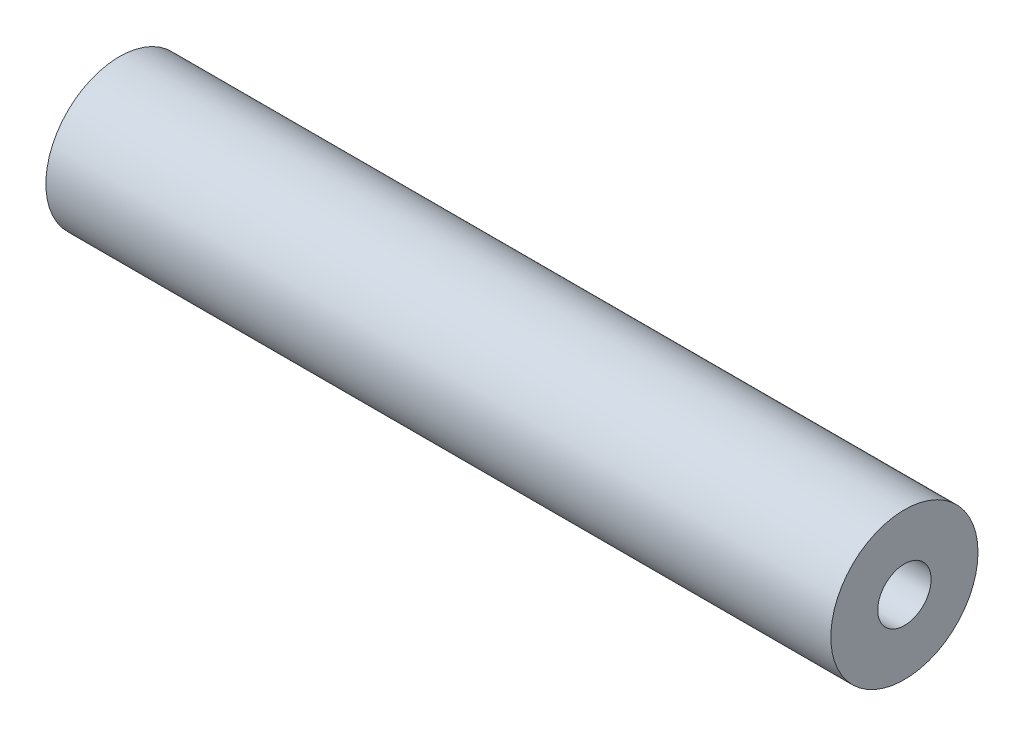
ISO-10303-21;
HEADER;
FILE_DESCRIPTION(('STEP AP214'),'2;1');
FILE_NAME('part.step','',(''),(''),'','','');
FILE_SCHEMA(('AUTOMOTIVE_DESIGN { 1 0 10303 214 1 1 1 1 }'));
ENDSEC;
DATA;
#1=APPLICATION_CONTEXT('core data for automotive mechanical design processes');
#2=APPLICATION_PROTOCOL_DEFINITION('international standard','automotive_design',2000,#1);
#3=PRODUCT_CONTEXT('',#1,'mechanical');
#4=PRODUCT('Part','Part','',(#3));
#5=PRODUCT_RELATED_PRODUCT_CATEGORY('part','',(#4));
#6=PRODUCT_DEFINITION_FORMATION('','',#4);
#7=PRODUCT_DEFINITION_CONTEXT('part definition',#1,'design');
#8=PRODUCT_DEFINITION('design','',#6,#7);
#9=PRODUCT_DEFINITION_SHAPE('','',#8);
#10=(LENGTH_UNIT() NAMED_UNIT(*) SI_UNIT(.MILLI.,.METRE.));
#11=(NAMED_UNIT(*) PLANE_ANGLE_UNIT() SI_UNIT($,.RADIAN.));
#12=(NAMED_UNIT(*) SI_UNIT($,.STERADIAN.) SOLID_ANGLE_UNIT());
#13=UNCERTAINTY_MEASURE_WITH_UNIT(LENGTH_MEASURE(1.E-05),#10,'distance_accuracy_value','');
#14=(GEOMETRIC_REPRESENTATION_CONTEXT(3) GLOBAL_UNCERTAINTY_ASSIGNED_CONTEXT((#13)) GLOBAL_UNIT_ASSIGNED_CONTEXT((#10,
#11,#12)) REPRESENTATION_CONTEXT('',''));
#15=CARTESIAN_POINT('',(0.,0.,0.));
#16=DIRECTION('',(0.,0.,1.));
#17=DIRECTION('',(1.,0.,0.));
#18=AXIS2_PLACEMENT_3D('',#15,#16,#17);
#19=CARTESIAN_POINT('',(19.557999999904,0.,0.));
#20=DIRECTION('',(1.,0.,0.));
#21=DIRECTION('',(0.,0.,-1.));
#22=AXIS2_PLACEMENT_3D('',#19,#20,#21);
#23=CONICAL_SURFACE('',#22,1.7271999997206,1.02974425844676);
#24=CARTESIAN_POINT('',(19.558,0.,0.));
#25=DIRECTION('',(1.,0.,0.));
#26=DIRECTION('',(0.,0.,-1.));
#27=AXIS2_PLACEMENT_3D('',#24,#25,#26);
#28=CIRCLE('',#27,1.7272);
#29=CARTESIAN_POINT('',(19.558,0.,-1.7272));
#30=VERTEX_POINT('',#29);
#31=EDGE_CURVE('P0_E69',#30,#30,#28,.T.);
#32=ORIENTED_EDGE('',*,*,#31,.T.);
#33=EDGE_LOOP('',(#32));
#34=FACE_BOUND('',#33,.T.);
#35=CARTESIAN_POINT('',(18.5201935387909,-1.98951966012828E-10,0.));
#36=VERTEX_POINT('',#35);
#37=VERTEX_LOOP('',#36);
#38=FACE_BOUND('',#37,.T.);
#39=ADVANCED_FACE('P0_F17',(#34,#38),#23,.F.);
#40=CARTESIAN_POINT('',(-10.413999999912,0.,0.));
#41=DIRECTION('',(-1.,0.,0.));
#42=DIRECTION('',(0.,0.,1.));
#43=AXIS2_PLACEMENT_3D('',#40,#41,#42);
#44=CONICAL_SURFACE('',#43,1.72719999977744,1.02974425845164);
#45=CARTESIAN_POINT('',(-10.414,0.,0.));
#46=DIRECTION('',(-1.,0.,0.));
#47=DIRECTION('',(0.,0.,1.));
#48=AXIS2_PLACEMENT_3D('',#45,#46,#47);
#49=CIRCLE('',#48,1.7272);
#50=CARTESIAN_POINT('',(-10.414,0.,1.7272));
#51=VERTEX_POINT('',#50);
#52=EDGE_CURVE('P0_E73',#51,#51,#49,.T.);
#53=ORIENTED_EDGE('',*,*,#52,.T.);
#54=EDGE_LOOP('',(#53));
#55=FACE_BOUND('',#54,.T.);
#56=CARTESIAN_POINT('',(-9.37619353868513,1.98951966012828E-10,0.));
#57=VERTEX_POINT('',#56);
#58=VERTEX_LOOP('',#57);
#59=FACE_BOUND('',#58,.T.);
#60=ADVANCED_FACE('P0_F33',(#55,#59),#44,.F.);
#61=CARTESIAN_POINT('',(17.9476032157556,0.,0.));
#62=DIRECTION('',(1.,0.,0.));
#63=DIRECTION('',(0.,0.,-1.));
#64=AXIS2_PLACEMENT_3D('',#61,#62,#63);
#65=CYLINDRICAL_SURFACE('',#64,1.7272);
#66=ORIENTED_EDGE('',*,*,#31,.F.);
#67=EDGE_LOOP('',(#66));
#68=FACE_BOUND('',#67,.T.);
#69=CARTESIAN_POINT('',(29.972,0.,0.));
#70=DIRECTION('',(1.,0.,0.));
#71=DIRECTION('',(0.,0.,-1.));
#72=AXIS2_PLACEMENT_3D('',#69,#70,#71);
#73=CIRCLE('',#72,1.7272);
#74=CARTESIAN_POINT('',(29.972,0.,-1.7272));
#75=VERTEX_POINT('',#74);
#76=EDGE_CURVE('P0_E20',#75,#75,#73,.T.);
#77=ORIENTED_EDGE('',*,*,#76,.T.);
#78=EDGE_LOOP('',(#77));
#79=FACE_BOUND('',#78,.T.);
#80=ADVANCED_FACE('P0_F39',(#68,#79),#65,.F.);
#81=CARTESIAN_POINT('',(-8.80360321575556,0.,0.));
#82=DIRECTION('',(-1.,0.,0.));
#83=DIRECTION('',(0.,0.,1.));
#84=AXIS2_PLACEMENT_3D('',#81,#82,#83);
#85=CYLINDRICAL_SURFACE('',#84,1.7272);
#86=ORIENTED_EDGE('',*,*,#52,.F.);
#87=EDGE_LOOP('',(#86));
#88=FACE_BOUND('',#87,.T.);
#89=CARTESIAN_POINT('',(-20.828,0.,0.));
#90=DIRECTION('',(-1.,0.,0.));
#91=DIRECTION('',(0.,0.,1.));
#92=AXIS2_PLACEMENT_3D('',#89,#90,#91);
#93=CIRCLE('',#92,1.7272);
#94=CARTESIAN_POINT('',(-20.828,0.,1.7272));
#95=VERTEX_POINT('',#94);
#96=EDGE_CURVE('P0_E72',#95,#95,#93,.T.);
#97=ORIENTED_EDGE('',*,*,#96,.T.);
#98=EDGE_LOOP('',(#97));
#99=FACE_BOUND('',#98,.T.);
#100=ADVANCED_FACE('P0_F58',(#88,#99),#85,.F.);
#101=CARTESIAN_POINT('',(29.972,36.83,57.15));
#102=DIRECTION('',(-1.,0.,0.));
#103=DIRECTION('',(0.,0.,1.));
#104=AXIS2_PLACEMENT_3D('',#101,#102,#103);
#105=PLANE('',#104);
#106=ORIENTED_EDGE('',*,*,#76,.F.);
#107=EDGE_LOOP('',(#106));
#108=FACE_BOUND('',#107,.T.);
#109=CARTESIAN_POINT('',(29.972,0.,0.));
#110=DIRECTION('',(1.,0.,0.));
#111=DIRECTION('',(0.,0.,-1.));
#112=AXIS2_PLACEMENT_3D('',#109,#110,#111);
#113=CIRCLE('',#112,4.7625);
#114=CARTESIAN_POINT('',(29.972,0.,-4.7625));
#115=VERTEX_POINT('',#114);
#116=EDGE_CURVE('P0_E26',#115,#115,#113,.F.);
#117=ORIENTED_EDGE('',*,*,#116,.F.);
#118=EDGE_LOOP('',(#117));
#119=FACE_BOUND('',#118,.T.);
#120=ADVANCED_FACE('P0_F50',(#108,#119),#105,.F.);
#121=CARTESIAN_POINT('',(-20.828,49.53,57.15));
#122=DIRECTION('',(1.,0.,0.));
#123=DIRECTION('',(0.,0.,-1.));
#124=AXIS2_PLACEMENT_3D('',#121,#122,#123);
#125=PLANE('',#124);
#126=ORIENTED_EDGE('',*,*,#96,.F.);
#127=EDGE_LOOP('',(#126));
#128=FACE_BOUND('',#127,.T.);
#129=CARTESIAN_POINT('',(-20.828,0.,0.));
#130=DIRECTION('',(1.,0.,0.));
#131=DIRECTION('',(0.,0.,-1.));
#132=AXIS2_PLACEMENT_3D('',#129,#130,#131);
#133=CIRCLE('',#132,4.7625);
#134=CARTESIAN_POINT('',(-20.828,0.,-4.7625));
#135=VERTEX_POINT('',#134);
#136=EDGE_CURVE('P0_E11',#135,#135,#133,.T.);
#137=ORIENTED_EDGE('',*,*,#136,.F.);
#138=EDGE_LOOP('',(#137));
#139=FACE_BOUND('',#138,.T.);
#140=ADVANCED_FACE('P0_F44',(#128,#139),#125,.F.);
#141=CARTESIAN_POINT('',(-20.828,0.,0.));
#142=DIRECTION('',(1.,0.,0.));
#143=DIRECTION('',(0.,0.,-1.));
#144=AXIS2_PLACEMENT_3D('',#141,#142,#143);
#145=CYLINDRICAL_SURFACE('',#144,4.7625);
#146=ORIENTED_EDGE('',*,*,#116,.T.);
#147=EDGE_LOOP('',(#146));
#148=FACE_BOUND('',#147,.T.);
#149=ORIENTED_EDGE('',*,*,#136,.T.);
#150=EDGE_LOOP('',(#149));
#151=FACE_BOUND('',#150,.T.);
#152=ADVANCED_FACE('P0_F42',(#148,#151),#145,.T.);
#153=CLOSED_SHELL('',(#39,#60,#80,#100,#120,#140,#152));
#154=MANIFOLD_SOLID_BREP('P0_B1',#153);
#155=CARTESIAN_POINT('',(-8.80360321575556,0.,0.));
#156=DIRECTION('',(-1.,0.,0.));
#157=DIRECTION('',(0.,0.,1.));
#158=AXIS2_PLACEMENT_3D('',#155,#156,#157);
#159=CYLINDRICAL_SURFACE('',#158,2.0828);
#160=CARTESIAN_POINT('',(-12.446,0.,0.));
#161=DIRECTION('',(-1.,0.,0.));
#162=DIRECTION('',(0.,0.,1.));
#163=AXIS2_PLACEMENT_3D('',#160,#161,#162);
#164=CIRCLE('',#163,2.0828);
#165=CARTESIAN_POINT('',(-12.446,0.,2.0828));
#166=VERTEX_POINT('',#165);
#167=EDGE_CURVE('P1_E11',#166,#166,#164,.T.);
#168=ORIENTED_EDGE('',*,*,#167,.T.);
#169=EDGE_LOOP('',(#168));
#170=FACE_BOUND('',#169,.T.);
#171=CARTESIAN_POINT('',(-20.828,0.,0.));
#172=DIRECTION('',(-1.,0.,0.));
#173=DIRECTION('',(0.,0.,1.));
#174=AXIS2_PLACEMENT_3D('',#171,#172,#173);
#175=CIRCLE('',#174,2.0828);
#176=CARTESIAN_POINT('',(-20.828,0.,2.0828));
#177=VERTEX_POINT('',#176);
#178=EDGE_CURVE('P1_E24',#177,#177,#175,.F.);
#179=ORIENTED_EDGE('',*,*,#178,.T.);
#180=EDGE_LOOP('',(#179));
#181=FACE_BOUND('',#180,.T.);
#182=ADVANCED_FACE('P1_F17',(#170,#181),#159,.T.);
#183=CARTESIAN_POINT('',(-12.446,0.,0.));
#184=DIRECTION('',(-1.,0.,0.));
#185=DIRECTION('',(0.,0.,1.));
#186=AXIS2_PLACEMENT_3D('',#183,#184,#185);
#187=PLANE('',#186);
#188=CARTESIAN_POINT('',(-12.446,1.7272,0.));
#189=CARTESIAN_POINT('',(-12.446,1.7272,0.329184550080663));
#190=CARTESIAN_POINT('',(-12.446,1.60593035359503,0.635773182355267));
#191=CARTESIAN_POINT('',(-12.446,1.47455101266503,0.967920703511191));
#192=CARTESIAN_POINT('',(-12.446,1.22131483246541,1.22131483246541));
#193=CARTESIAN_POINT('',(-12.446,0.968823610204818,1.47396353883458));
#194=CARTESIAN_POINT('',(-12.446,0.635773182355267,1.60593035359503));
#195=CARTESIAN_POINT('',(-12.446,0.32997539896807,1.72709866944132));
#196=CARTESIAN_POINT('',(-12.446,0.,1.7272));
#197=CARTESIAN_POINT('',(-12.446,-0.328929182820167,1.7273010092812));
#198=CARTESIAN_POINT('',(-12.446,-0.635773182355267,1.60593035359503));
#199=CARTESIAN_POINT('',(-12.446,-0.967920703511343,1.47455101266503));
#200=CARTESIAN_POINT('',(-12.446,-1.22131483246541,1.22131483246541));
#201=CARTESIAN_POINT('',(-12.446,-1.47396353883455,0.968823610204701));
#202=CARTESIAN_POINT('',(-12.446,-1.60593035359503,0.635773182355267));
#203=CARTESIAN_POINT('',(-12.446,-1.7272,0.329719666601096));
#204=CARTESIAN_POINT('',(-12.446,-1.7272,0.));
#205=B_SPLINE_CURVE_WITH_KNOTS('',2,(#188,#189,#190,#191,#192,#193,#194,#195,#196,#197,#198,
#199,#200,#201,#202,#203,#204),.UNSPECIFIED.,.F.,.F.,(3,2,2,2,2,2,2,2,3),(0.,0.125,0.25,0.375,
0.5,0.625,0.75,0.875,1.),.UNSPECIFIED.);
#206=CARTESIAN_POINT('',(-12.446,1.7272,0.));
#207=VERTEX_POINT('',#206);
#208=CARTESIAN_POINT('',(-12.446,-1.7272,0.));
#209=VERTEX_POINT('',#208);
#210=EDGE_CURVE('P1_E28',#207,#209,#205,.T.);
#211=ORIENTED_EDGE('',*,*,#210,.F.);
#212=CARTESIAN_POINT('',(-12.446,-1.7272,0.));
#213=CARTESIAN_POINT('',(-12.446,-1.7272,-0.329184550080663));
#214=CARTESIAN_POINT('',(-12.446,-1.60593035359503,-0.635773182355267));
#215=CARTESIAN_POINT('',(-12.446,-1.47455101266503,-0.967920703511191));
#216=CARTESIAN_POINT('',(-12.446,-1.22131483246541,-1.22131483246541));
#217=CARTESIAN_POINT('',(-12.446,-0.968823610204818,-1.47396353883458));
#218=CARTESIAN_POINT('',(-12.446,-0.635773182355267,-1.60593035359503));
#219=CARTESIAN_POINT('',(-12.446,-0.32997539896807,-1.72709866944132));
#220=CARTESIAN_POINT('',(-12.446,0.,-1.7272));
#221=CARTESIAN_POINT('',(-12.446,0.328929182820167,-1.7273010092812));
#222=CARTESIAN_POINT('',(-12.446,0.635773182355267,-1.60593035359503));
#223=CARTESIAN_POINT('',(-12.446,0.967920703511343,-1.47455101266503));
#224=CARTESIAN_POINT('',(-12.446,1.22131483246541,-1.22131483246541));
#225=CARTESIAN_POINT('',(-12.446,1.47396353883455,-0.968823610204701));
#226=CARTESIAN_POINT('',(-12.446,1.60593035359503,-0.635773182355267));
#227=CARTESIAN_POINT('',(-12.446,1.7272,-0.329719666601096));
#228=CARTESIAN_POINT('',(-12.446,1.7272,0.));
#229=B_SPLINE_CURVE_WITH_KNOTS('',2,(#212,#213,#214,#215,#216,#217,#218,#219,#220,#221,#222,
#223,#224,#225,#226,#227,#228),.UNSPECIFIED.,.F.,.F.,(3,2,2,2,2,2,2,2,3),(0.,0.125,0.25,0.375,
0.5,0.625,0.75,0.875,1.),.UNSPECIFIED.);
#230=EDGE_CURVE('P1_E33',#209,#207,#229,.T.);
#231=ORIENTED_EDGE('',*,*,#230,.F.);
#232=EDGE_LOOP('',(#211,#231));
#233=FACE_BOUND('',#232,.T.);
#234=ORIENTED_EDGE('',*,*,#167,.F.);
#235=EDGE_LOOP('',(#234));
#236=FACE_BOUND('',#235,.T.);
#237=ADVANCED_FACE('P1_F18',(#233,#236),#187,.F.);
#238=OPEN_SHELL('',(#182,#237));
#239=SHELL_BASED_SURFACE_MODEL('P1_B1',(#238));
#240=CARTESIAN_POINT('',(17.9476032157556,0.,0.));
#241=DIRECTION('',(1.,0.,0.));
#242=DIRECTION('',(0.,0.,-1.));
#243=AXIS2_PLACEMENT_3D('',#240,#241,#242);
#244=CYLINDRICAL_SURFACE('',#243,2.0828);
#245=CARTESIAN_POINT('',(21.59,0.,0.));
#246=DIRECTION('',(1.,0.,0.));
#247=DIRECTION('',(0.,0.,-1.));
#248=AXIS2_PLACEMENT_3D('',#245,#246,#247);
#249=CIRCLE('',#248,2.0828);
#250=CARTESIAN_POINT('',(21.59,0.,-2.0828));
#251=VERTEX_POINT('',#250);
#252=EDGE_CURVE('P2_E11',#251,#251,#249,.T.);
#253=ORIENTED_EDGE('',*,*,#252,.T.);
#254=EDGE_LOOP('',(#253));
#255=FACE_BOUND('',#254,.T.);
#256=CARTESIAN_POINT('',(29.972,0.,0.));
#257=DIRECTION('',(1.,0.,0.));
#258=DIRECTION('',(0.,0.,-1.));
#259=AXIS2_PLACEMENT_3D('',#256,#257,#258);
#260=CIRCLE('',#259,2.0828);
#261=CARTESIAN_POINT('',(29.972,0.,-2.0828));
#262=VERTEX_POINT('',#261);
#263=EDGE_CURVE('P2_E24',#262,#262,#260,.F.);
#264=ORIENTED_EDGE('',*,*,#263,.T.);
#265=EDGE_LOOP('',(#264));
#266=FACE_BOUND('',#265,.T.);
#267=ADVANCED_FACE('P2_F17',(#255,#266),#244,.T.);
#268=CARTESIAN_POINT('',(21.59,0.,0.));
#269=DIRECTION('',(1.,0.,0.));
#270=DIRECTION('',(0.,0.,-1.));
#271=AXIS2_PLACEMENT_3D('',#268,#269,#270);
#272=PLANE('',#271);
#273=CARTESIAN_POINT('',(21.59,-1.7272,0.));
#274=CARTESIAN_POINT('',(21.59,-1.7272,0.329184550080663));
#275=CARTESIAN_POINT('',(21.59,-1.60593035359503,0.635773182355267));
#276=CARTESIAN_POINT('',(21.59,-1.47455101266503,0.967920703511191));
#277=CARTESIAN_POINT('',(21.59,-1.22131483246541,1.22131483246541));
#278=CARTESIAN_POINT('',(21.59,-0.968823610204818,1.47396353883458));
#279=CARTESIAN_POINT('',(21.59,-0.635773182355267,1.60593035359503));
#280=CARTESIAN_POINT('',(21.59,-0.32997539896807,1.72709866944132));
#281=CARTESIAN_POINT('',(21.59,0.,1.7272));
#282=CARTESIAN_POINT('',(21.59,0.328929182820167,1.7273010092812));
#283=CARTESIAN_POINT('',(21.59,0.635773182355267,1.60593035359503));
#284=CARTESIAN_POINT('',(21.59,0.967920703511343,1.47455101266503));
#285=CARTESIAN_POINT('',(21.59,1.22131483246541,1.22131483246541));
#286=CARTESIAN_POINT('',(21.59,1.47396353883455,0.968823610204701));
#287=CARTESIAN_POINT('',(21.59,1.60593035359503,0.635773182355267));
#288=CARTESIAN_POINT('',(21.59,1.7272,0.329719666601096));
#289=CARTESIAN_POINT('',(21.59,1.7272,0.));
#290=B_SPLINE_CURVE_WITH_KNOTS('',2,(#273,#274,#275,#276,#277,#278,#279,#280,#281,#282,#283,
#284,#285,#286,#287,#288,#289),.UNSPECIFIED.,.F.,.F.,(3,2,2,2,2,2,2,2,3),(0.,0.125,0.25,0.375,
0.5,0.625,0.75,0.875,1.),.UNSPECIFIED.);
#291=CARTESIAN_POINT('',(21.59,-1.7272,0.));
#292=VERTEX_POINT('',#291);
#293=CARTESIAN_POINT('',(21.59,1.7272,0.));
#294=VERTEX_POINT('',#293);
#295=EDGE_CURVE('P2_E28',#292,#294,#290,.T.);
#296=ORIENTED_EDGE('',*,*,#295,.F.);
#297=CARTESIAN_POINT('',(21.59,1.7272,0.));
#298=CARTESIAN_POINT('',(21.59,1.7272,-0.329184550080663));
#299=CARTESIAN_POINT('',(21.59,1.60593035359503,-0.635773182355267));
#300=CARTESIAN_POINT('',(21.59,1.47455101266503,-0.967920703511191));
#301=CARTESIAN_POINT('',(21.59,1.22131483246541,-1.22131483246541));
#302=CARTESIAN_POINT('',(21.59,0.968823610204818,-1.47396353883458));
#303=CARTESIAN_POINT('',(21.59,0.635773182355267,-1.60593035359503));
#304=CARTESIAN_POINT('',(21.59,0.32997539896807,-1.72709866944132));
#305=CARTESIAN_POINT('',(21.59,0.,-1.7272));
#306=CARTESIAN_POINT('',(21.59,-0.328929182820167,-1.7273010092812));
#307=CARTESIAN_POINT('',(21.59,-0.635773182355267,-1.60593035359503));
#308=CARTESIAN_POINT('',(21.59,-0.967920703511343,-1.47455101266503));
#309=CARTESIAN_POINT('',(21.59,-1.22131483246541,-1.22131483246541));
#310=CARTESIAN_POINT('',(21.59,-1.47396353883455,-0.968823610204701));
#311=CARTESIAN_POINT('',(21.59,-1.60593035359503,-0.635773182355267));
#312=CARTESIAN_POINT('',(21.59,-1.7272,-0.329719666601096));
#313=CARTESIAN_POINT('',(21.59,-1.7272,0.));
#314=B_SPLINE_CURVE_WITH_KNOTS('',2,(#297,#298,#299,#300,#301,#302,#303,#304,#305,#306,#307,
#308,#309,#310,#311,#312,#313),.UNSPECIFIED.,.F.,.F.,(3,2,2,2,2,2,2,2,3),(0.,0.125,0.25,0.375,
0.5,0.625,0.75,0.875,1.),.UNSPECIFIED.);
#315=EDGE_CURVE('P2_E33',#294,#292,#314,.T.);
#316=ORIENTED_EDGE('',*,*,#315,.F.);
#317=EDGE_LOOP('',(#296,#316));
#318=FACE_BOUND('',#317,.T.);
#319=ORIENTED_EDGE('',*,*,#252,.F.);
#320=EDGE_LOOP('',(#319));
#321=FACE_BOUND('',#320,.T.);
#322=ADVANCED_FACE('P2_F18',(#318,#321),#272,.F.);
#323=OPEN_SHELL('',(#267,#322));
#324=SHELL_BASED_SURFACE_MODEL('P2_B1',(#323));
#325=ADVANCED_BREP_SHAPE_REPRESENTATION('',(#18,#154),#14);
#326=MANIFOLD_SURFACE_SHAPE_REPRESENTATION('',(#18,#239,#324),#14);
#327=SHAPE_REPRESENTATION('',(#18),#14);
#328=SHAPE_DEFINITION_REPRESENTATION(#9,#327);
#329=SHAPE_REPRESENTATION_RELATIONSHIP('','',#327,#325);
#330=SHAPE_REPRESENTATION_RELATIONSHIP('','',#327,#326);
ENDSEC;
END-ISO-10303-21;
